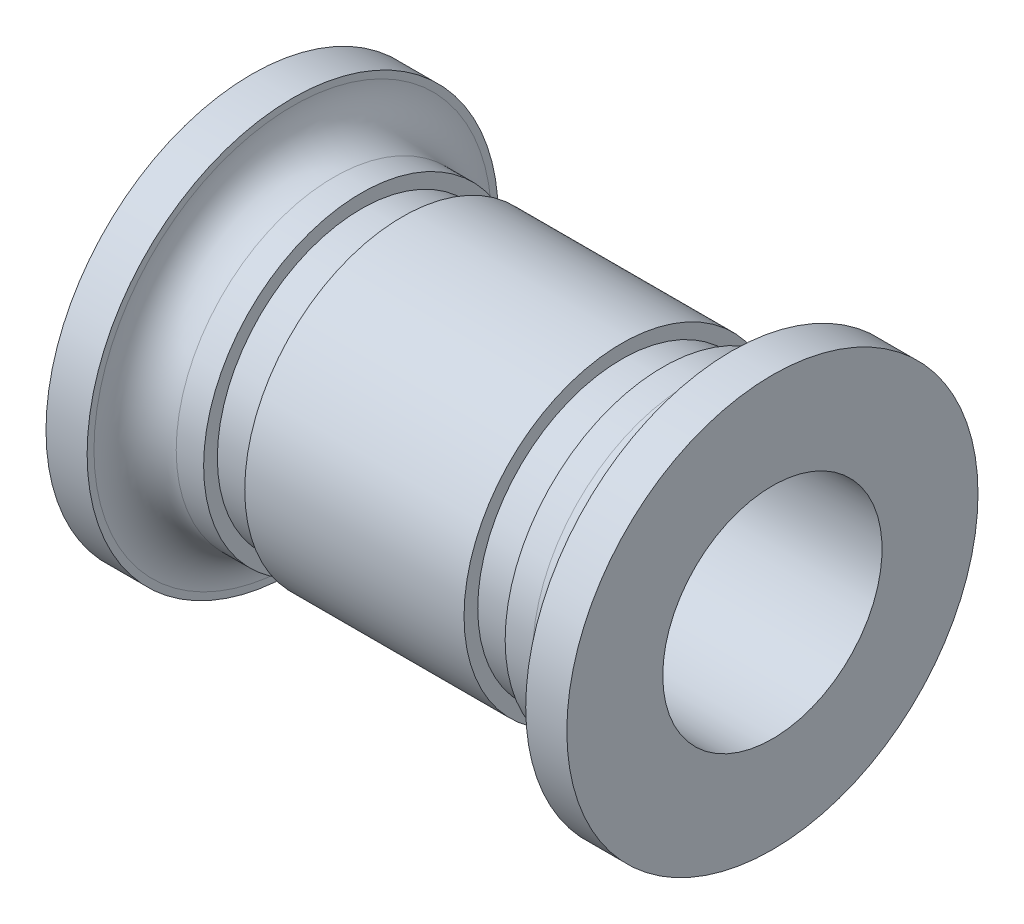
ISO-10303-21;
HEADER;
FILE_DESCRIPTION(('STEP AP214'),'2;1');
FILE_NAME('part.step','',(''),(''),'','','');
FILE_SCHEMA(('AUTOMOTIVE_DESIGN { 1 0 10303 214 1 1 1 1 }'));
ENDSEC;
DATA;
#1=APPLICATION_CONTEXT('core data for automotive mechanical design processes');
#2=APPLICATION_PROTOCOL_DEFINITION('international standard','automotive_design',2000,#1);
#3=PRODUCT_CONTEXT('',#1,'mechanical');
#4=PRODUCT('Part','Part','',(#3));
#5=PRODUCT_RELATED_PRODUCT_CATEGORY('part','',(#4));
#6=PRODUCT_DEFINITION_FORMATION('','',#4);
#7=PRODUCT_DEFINITION_CONTEXT('part definition',#1,'design');
#8=PRODUCT_DEFINITION('design','',#6,#7);
#9=PRODUCT_DEFINITION_SHAPE('','',#8);
#10=(LENGTH_UNIT() NAMED_UNIT(*) SI_UNIT(.MILLI.,.METRE.));
#11=(NAMED_UNIT(*) PLANE_ANGLE_UNIT() SI_UNIT($,.RADIAN.));
#12=(NAMED_UNIT(*) SI_UNIT($,.STERADIAN.) SOLID_ANGLE_UNIT());
#13=UNCERTAINTY_MEASURE_WITH_UNIT(LENGTH_MEASURE(1.E-05),#10,'distance_accuracy_value','');
#14=(GEOMETRIC_REPRESENTATION_CONTEXT(3) GLOBAL_UNCERTAINTY_ASSIGNED_CONTEXT((#13)) GLOBAL_UNIT_ASSIGNED_CONTEXT((#10,
#11,#12)) REPRESENTATION_CONTEXT('',''));
#15=CARTESIAN_POINT('',(0.,0.,0.));
#16=DIRECTION('',(0.,0.,1.));
#17=DIRECTION('',(1.,0.,0.));
#18=AXIS2_PLACEMENT_3D('',#15,#16,#17);
#19=CARTESIAN_POINT('',(320.,0.,0.));
#20=DIRECTION('',(-1.,0.,0.));
#21=DIRECTION('',(0.,0.,1.));
#22=AXIS2_PLACEMENT_3D('',#19,#20,#21);
#23=TOROIDAL_SURFACE('',#22,145.,30.);
#24=CARTESIAN_POINT('',(350.,0.,0.));
#25=DIRECTION('',(-1.,0.,0.));
#26=DIRECTION('',(0.,0.,1.));
#27=AXIS2_PLACEMENT_3D('',#24,#25,#26);
#28=CIRCLE('',#27,145.);
#29=CARTESIAN_POINT('',(350.,0.,145.));
#30=VERTEX_POINT('',#29);
#31=EDGE_CURVE('E100',#30,#30,#28,.T.);
#32=ORIENTED_EDGE('',*,*,#31,.T.);
#33=EDGE_LOOP('',(#32));
#34=FACE_BOUND('',#33,.T.);
#35=CARTESIAN_POINT('',(320.,0.,0.));
#36=DIRECTION('',(-1.,0.,0.));
#37=DIRECTION('',(0.,0.,1.));
#38=AXIS2_PLACEMENT_3D('',#35,#36,#37);
#39=CIRCLE('',#38,115.);
#40=CARTESIAN_POINT('',(320.,0.,115.));
#41=VERTEX_POINT('',#40);
#42=EDGE_CURVE('E10',#41,#41,#39,.T.);
#43=ORIENTED_EDGE('',*,*,#42,.F.);
#44=EDGE_LOOP('',(#43));
#45=FACE_BOUND('',#44,.T.);
#46=ADVANCED_FACE('F39',(#34,#45),#23,.F.);
#47=CARTESIAN_POINT('',(0.,0.,0.));
#48=DIRECTION('',(-1.,0.,0.));
#49=DIRECTION('',(0.,0.,1.));
#50=AXIS2_PLACEMENT_3D('',#47,#48,#49);
#51=CYLINDRICAL_SURFACE('',#50,115.);
#52=ORIENTED_EDGE('',*,*,#42,.T.);
#53=EDGE_LOOP('',(#52));
#54=FACE_BOUND('',#53,.T.);
#55=CARTESIAN_POINT('',(300.,0.,0.));
#56=DIRECTION('',(-1.,0.,0.));
#57=DIRECTION('',(0.,0.,1.));
#58=AXIS2_PLACEMENT_3D('',#55,#56,#57);
#59=CIRCLE('',#58,115.);
#60=CARTESIAN_POINT('',(300.,0.,115.));
#61=VERTEX_POINT('',#60);
#62=EDGE_CURVE('E44',#61,#61,#59,.T.);
#63=ORIENTED_EDGE('',*,*,#62,.F.);
#64=EDGE_LOOP('',(#63));
#65=FACE_BOUND('',#64,.T.);
#66=ADVANCED_FACE('F113',(#54,#65),#51,.T.);
#67=CARTESIAN_POINT('',(300.,1.66533453693774E-12,0.));
#68=DIRECTION('',(1.,0.,0.));
#69=DIRECTION('',(0.,0.,-1.));
#70=AXIS2_PLACEMENT_3D('',#67,#68,#69);
#71=PLANE('',#70);
#72=CARTESIAN_POINT('',(300.,0.,0.));
#73=DIRECTION('',(-1.,0.,0.));
#74=DIRECTION('',(0.,0.,1.));
#75=AXIS2_PLACEMENT_3D('',#72,#73,#74);
#76=CIRCLE('',#75,105.);
#77=CARTESIAN_POINT('',(300.,0.,105.));
#78=VERTEX_POINT('',#77);
#79=EDGE_CURVE('E47',#78,#78,#76,.T.);
#80=ORIENTED_EDGE('',*,*,#79,.F.);
#81=EDGE_LOOP('',(#80));
#82=FACE_BOUND('',#81,.T.);
#83=ORIENTED_EDGE('',*,*,#62,.T.);
#84=EDGE_LOOP('',(#83));
#85=FACE_BOUND('',#84,.T.);
#86=ADVANCED_FACE('F118',(#82,#85),#71,.F.);
#87=CARTESIAN_POINT('',(0.,0.,0.));
#88=DIRECTION('',(-1.,0.,0.));
#89=DIRECTION('',(0.,0.,1.));
#90=AXIS2_PLACEMENT_3D('',#87,#88,#89);
#91=CYLINDRICAL_SURFACE('',#90,105.);
#92=CARTESIAN_POINT('',(270.,0.,0.));
#93=DIRECTION('',(-1.,0.,0.));
#94=DIRECTION('',(0.,0.,1.));
#95=AXIS2_PLACEMENT_3D('',#92,#93,#94);
#96=CIRCLE('',#95,105.);
#97=CARTESIAN_POINT('',(270.,0.,105.));
#98=VERTEX_POINT('',#97);
#99=EDGE_CURVE('E52',#98,#98,#96,.T.);
#100=ORIENTED_EDGE('',*,*,#99,.F.);
#101=EDGE_LOOP('',(#100));
#102=FACE_BOUND('',#101,.T.);
#103=ORIENTED_EDGE('',*,*,#79,.T.);
#104=EDGE_LOOP('',(#103));
#105=FACE_BOUND('',#104,.T.);
#106=ADVANCED_FACE('F125',(#102,#105),#91,.T.);
#107=CARTESIAN_POINT('',(270.,0.,0.));
#108=DIRECTION('',(1.,0.,0.));
#109=DIRECTION('',(0.,0.,-1.));
#110=AXIS2_PLACEMENT_3D('',#107,#108,#109);
#111=PLANE('',#110);
#112=ORIENTED_EDGE('',*,*,#99,.T.);
#113=EDGE_LOOP('',(#112));
#114=FACE_BOUND('',#113,.T.);
#115=CARTESIAN_POINT('',(270.,0.,0.));
#116=DIRECTION('',(-1.,0.,0.));
#117=DIRECTION('',(0.,0.,1.));
#118=AXIS2_PLACEMENT_3D('',#115,#116,#117);
#119=CIRCLE('',#118,115.);
#120=CARTESIAN_POINT('',(270.,0.,115.));
#121=VERTEX_POINT('',#120);
#122=EDGE_CURVE('E59',#121,#121,#119,.T.);
#123=ORIENTED_EDGE('',*,*,#122,.F.);
#124=EDGE_LOOP('',(#123));
#125=FACE_BOUND('',#124,.T.);
#126=ADVANCED_FACE('F128',(#114,#125),#111,.T.);
#127=CARTESIAN_POINT('',(0.,0.,0.));
#128=DIRECTION('',(-1.,0.,0.));
#129=DIRECTION('',(0.,0.,1.));
#130=AXIS2_PLACEMENT_3D('',#127,#128,#129);
#131=CYLINDRICAL_SURFACE('',#130,115.);
#132=CARTESIAN_POINT('',(110.,0.,0.));
#133=DIRECTION('',(-1.,0.,0.));
#134=DIRECTION('',(0.,0.,1.));
#135=AXIS2_PLACEMENT_3D('',#132,#133,#134);
#136=CIRCLE('',#135,115.);
#137=CARTESIAN_POINT('',(110.,0.,115.));
#138=VERTEX_POINT('',#137);
#139=EDGE_CURVE('E64',#138,#138,#136,.T.);
#140=ORIENTED_EDGE('',*,*,#139,.F.);
#141=EDGE_LOOP('',(#140));
#142=FACE_BOUND('',#141,.T.);
#143=ORIENTED_EDGE('',*,*,#122,.T.);
#144=EDGE_LOOP('',(#143));
#145=FACE_BOUND('',#144,.T.);
#146=ADVANCED_FACE('F133',(#142,#145),#131,.T.);
#147=CARTESIAN_POINT('',(110.,3.05311331771919E-13,0.));
#148=DIRECTION('',(1.,0.,0.));
#149=DIRECTION('',(0.,0.,-1.));
#150=AXIS2_PLACEMENT_3D('',#147,#148,#149);
#151=PLANE('',#150);
#152=CARTESIAN_POINT('',(110.,0.,0.));
#153=DIRECTION('',(-1.,0.,0.));
#154=DIRECTION('',(0.,0.,1.));
#155=AXIS2_PLACEMENT_3D('',#152,#153,#154);
#156=CIRCLE('',#155,105.);
#157=CARTESIAN_POINT('',(110.,0.,105.));
#158=VERTEX_POINT('',#157);
#159=EDGE_CURVE('E63',#158,#158,#156,.T.);
#160=ORIENTED_EDGE('',*,*,#159,.F.);
#161=EDGE_LOOP('',(#160));
#162=FACE_BOUND('',#161,.T.);
#163=ORIENTED_EDGE('',*,*,#139,.T.);
#164=EDGE_LOOP('',(#163));
#165=FACE_BOUND('',#164,.T.);
#166=ADVANCED_FACE('F140',(#162,#165),#151,.F.);
#167=CARTESIAN_POINT('',(0.,0.,0.));
#168=DIRECTION('',(-1.,0.,0.));
#169=DIRECTION('',(0.,0.,1.));
#170=AXIS2_PLACEMENT_3D('',#167,#168,#169);
#171=CYLINDRICAL_SURFACE('',#170,105.);
#172=ORIENTED_EDGE('',*,*,#159,.T.);
#173=EDGE_LOOP('',(#172));
#174=FACE_BOUND('',#173,.T.);
#175=CARTESIAN_POINT('',(80.,0.,0.));
#176=DIRECTION('',(-1.,0.,0.));
#177=DIRECTION('',(0.,0.,1.));
#178=AXIS2_PLACEMENT_3D('',#175,#176,#177);
#179=CIRCLE('',#178,105.);
#180=CARTESIAN_POINT('',(80.,0.,105.));
#181=VERTEX_POINT('',#180);
#182=EDGE_CURVE('E69',#181,#181,#179,.T.);
#183=ORIENTED_EDGE('',*,*,#182,.F.);
#184=EDGE_LOOP('',(#183));
#185=FACE_BOUND('',#184,.T.);
#186=ADVANCED_FACE('F142',(#174,#185),#171,.T.);
#187=CARTESIAN_POINT('',(80.,1.11022302462516E-13,0.));
#188=DIRECTION('',(1.,0.,0.));
#189=DIRECTION('',(0.,0.,-1.));
#190=AXIS2_PLACEMENT_3D('',#187,#188,#189);
#191=PLANE('',#190);
#192=ORIENTED_EDGE('',*,*,#182,.T.);
#193=EDGE_LOOP('',(#192));
#194=FACE_BOUND('',#193,.T.);
#195=CARTESIAN_POINT('',(80.,0.,0.));
#196=DIRECTION('',(-1.,0.,0.));
#197=DIRECTION('',(0.,0.,1.));
#198=AXIS2_PLACEMENT_3D('',#195,#196,#197);
#199=CIRCLE('',#198,115.);
#200=CARTESIAN_POINT('',(80.,0.,115.));
#201=VERTEX_POINT('',#200);
#202=EDGE_CURVE('E68',#201,#201,#199,.T.);
#203=ORIENTED_EDGE('',*,*,#202,.F.);
#204=EDGE_LOOP('',(#203));
#205=FACE_BOUND('',#204,.T.);
#206=ADVANCED_FACE('F148',(#194,#205),#191,.T.);
#207=CARTESIAN_POINT('',(0.,0.,0.));
#208=DIRECTION('',(-1.,0.,0.));
#209=DIRECTION('',(0.,0.,1.));
#210=AXIS2_PLACEMENT_3D('',#207,#208,#209);
#211=CYLINDRICAL_SURFACE('',#210,115.);
#212=ORIENTED_EDGE('',*,*,#202,.T.);
#213=EDGE_LOOP('',(#212));
#214=FACE_BOUND('',#213,.T.);
#215=CARTESIAN_POINT('',(60.,0.,0.));
#216=DIRECTION('',(-1.,0.,0.));
#217=DIRECTION('',(0.,0.,1.));
#218=AXIS2_PLACEMENT_3D('',#215,#216,#217);
#219=CIRCLE('',#218,115.);
#220=CARTESIAN_POINT('',(60.,0.,115.));
#221=VERTEX_POINT('',#220);
#222=EDGE_CURVE('E71',#221,#221,#219,.T.);
#223=ORIENTED_EDGE('',*,*,#222,.F.);
#224=EDGE_LOOP('',(#223));
#225=FACE_BOUND('',#224,.T.);
#226=ADVANCED_FACE('F147',(#214,#225),#211,.T.);
#227=CARTESIAN_POINT('',(60.,0.,0.));
#228=DIRECTION('',(-1.,0.,0.));
#229=DIRECTION('',(0.,0.,1.));
#230=AXIS2_PLACEMENT_3D('',#227,#228,#229);
#231=TOROIDAL_SURFACE('',#230,145.,30.);
#232=ORIENTED_EDGE('',*,*,#222,.T.);
#233=EDGE_LOOP('',(#232));
#234=FACE_BOUND('',#233,.T.);
#235=CARTESIAN_POINT('',(30.,0.,0.));
#236=DIRECTION('',(-1.,0.,0.));
#237=DIRECTION('',(0.,0.,1.));
#238=AXIS2_PLACEMENT_3D('',#235,#236,#237);
#239=CIRCLE('',#238,145.);
#240=CARTESIAN_POINT('',(30.,0.,145.));
#241=VERTEX_POINT('',#240);
#242=EDGE_CURVE('E79',#241,#241,#239,.T.);
#243=ORIENTED_EDGE('',*,*,#242,.F.);
#244=EDGE_LOOP('',(#243));
#245=FACE_BOUND('',#244,.T.);
#246=ADVANCED_FACE('F152',(#234,#245),#231,.F.);
#247=CARTESIAN_POINT('',(30.,0.,0.));
#248=DIRECTION('',(1.,0.,0.));
#249=DIRECTION('',(0.,0.,-1.));
#250=AXIS2_PLACEMENT_3D('',#247,#248,#249);
#251=PLANE('',#250);
#252=ORIENTED_EDGE('',*,*,#242,.T.);
#253=EDGE_LOOP('',(#252));
#254=FACE_BOUND('',#253,.T.);
#255=CARTESIAN_POINT('',(30.,0.,0.));
#256=DIRECTION('',(-1.,0.,0.));
#257=DIRECTION('',(0.,0.,1.));
#258=AXIS2_PLACEMENT_3D('',#255,#256,#257);
#259=CIRCLE('',#258,150.);
#260=CARTESIAN_POINT('',(30.,0.,150.));
#261=VERTEX_POINT('',#260);
#262=EDGE_CURVE('E78',#261,#261,#259,.T.);
#263=ORIENTED_EDGE('',*,*,#262,.F.);
#264=EDGE_LOOP('',(#263));
#265=FACE_BOUND('',#264,.T.);
#266=ADVANCED_FACE('F158',(#254,#265),#251,.T.);
#267=CARTESIAN_POINT('',(0.,0.,0.));
#268=DIRECTION('',(-1.,0.,0.));
#269=DIRECTION('',(0.,0.,1.));
#270=AXIS2_PLACEMENT_3D('',#267,#268,#269);
#271=CYLINDRICAL_SURFACE('',#270,150.);
#272=ORIENTED_EDGE('',*,*,#262,.T.);
#273=EDGE_LOOP('',(#272));
#274=FACE_BOUND('',#273,.T.);
#275=CARTESIAN_POINT('',(0.,0.,0.));
#276=DIRECTION('',(-1.,0.,0.));
#277=DIRECTION('',(0.,0.,1.));
#278=AXIS2_PLACEMENT_3D('',#275,#276,#277);
#279=CIRCLE('',#278,150.);
#280=CARTESIAN_POINT('',(0.,0.,150.));
#281=VERTEX_POINT('',#280);
#282=EDGE_CURVE('E84',#281,#281,#279,.T.);
#283=ORIENTED_EDGE('',*,*,#282,.F.);
#284=EDGE_LOOP('',(#283));
#285=FACE_BOUND('',#284,.T.);
#286=ADVANCED_FACE('F165',(#274,#285),#271,.T.);
#287=CARTESIAN_POINT('',(0.,0.,0.));
#288=DIRECTION('',(1.,0.,0.));
#289=DIRECTION('',(0.,0.,-1.));
#290=AXIS2_PLACEMENT_3D('',#287,#288,#289);
#291=PLANE('',#290);
#292=CARTESIAN_POINT('',(0.,0.,0.));
#293=DIRECTION('',(-1.,0.,0.));
#294=DIRECTION('',(0.,0.,1.));
#295=AXIS2_PLACEMENT_3D('',#292,#293,#294);
#296=CIRCLE('',#295,80.);
#297=CARTESIAN_POINT('',(0.,0.,80.));
#298=VERTEX_POINT('',#297);
#299=EDGE_CURVE('E83',#298,#298,#296,.T.);
#300=ORIENTED_EDGE('',*,*,#299,.F.);
#301=EDGE_LOOP('',(#300));
#302=FACE_BOUND('',#301,.T.);
#303=ORIENTED_EDGE('',*,*,#282,.T.);
#304=EDGE_LOOP('',(#303));
#305=FACE_BOUND('',#304,.T.);
#306=ADVANCED_FACE('F167',(#302,#305),#291,.F.);
#307=CARTESIAN_POINT('',(0.,0.,0.));
#308=DIRECTION('',(-1.,0.,0.));
#309=DIRECTION('',(0.,0.,1.));
#310=AXIS2_PLACEMENT_3D('',#307,#308,#309);
#311=CYLINDRICAL_SURFACE('',#310,80.);
#312=CARTESIAN_POINT('',(380.,0.,0.));
#313=DIRECTION('',(-1.,0.,0.));
#314=DIRECTION('',(0.,0.,1.));
#315=AXIS2_PLACEMENT_3D('',#312,#313,#314);
#316=CIRCLE('',#315,80.);
#317=CARTESIAN_POINT('',(380.,0.,80.));
#318=VERTEX_POINT('',#317);
#319=EDGE_CURVE('E86',#318,#318,#316,.T.);
#320=ORIENTED_EDGE('',*,*,#319,.F.);
#321=EDGE_LOOP('',(#320));
#322=FACE_BOUND('',#321,.T.);
#323=ORIENTED_EDGE('',*,*,#299,.T.);
#324=EDGE_LOOP('',(#323));
#325=FACE_BOUND('',#324,.T.);
#326=ADVANCED_FACE('F168',(#322,#325),#311,.F.);
#327=CARTESIAN_POINT('',(380.,-3.01346249541114E-13,0.));
#328=DIRECTION('',(1.,0.,0.));
#329=DIRECTION('',(0.,0.,-1.));
#330=AXIS2_PLACEMENT_3D('',#327,#328,#329);
#331=PLANE('',#330);
#332=ORIENTED_EDGE('',*,*,#319,.T.);
#333=EDGE_LOOP('',(#332));
#334=FACE_BOUND('',#333,.T.);
#335=CARTESIAN_POINT('',(380.,0.,0.));
#336=DIRECTION('',(-1.,0.,0.));
#337=DIRECTION('',(0.,0.,1.));
#338=AXIS2_PLACEMENT_3D('',#335,#336,#337);
#339=CIRCLE('',#338,150.);
#340=CARTESIAN_POINT('',(380.,0.,150.));
#341=VERTEX_POINT('',#340);
#342=EDGE_CURVE('E93',#341,#341,#339,.T.);
#343=ORIENTED_EDGE('',*,*,#342,.F.);
#344=EDGE_LOOP('',(#343));
#345=FACE_BOUND('',#344,.T.);
#346=ADVANCED_FACE('F112',(#334,#345),#331,.T.);
#347=CARTESIAN_POINT('',(0.,0.,0.));
#348=DIRECTION('',(-1.,0.,0.));
#349=DIRECTION('',(0.,0.,1.));
#350=AXIS2_PLACEMENT_3D('',#347,#348,#349);
#351=CYLINDRICAL_SURFACE('',#350,150.);
#352=CARTESIAN_POINT('',(350.,0.,0.));
#353=DIRECTION('',(-1.,0.,0.));
#354=DIRECTION('',(0.,0.,1.));
#355=AXIS2_PLACEMENT_3D('',#352,#353,#354);
#356=CIRCLE('',#355,150.);
#357=CARTESIAN_POINT('',(350.,0.,150.));
#358=VERTEX_POINT('',#357);
#359=EDGE_CURVE('E94',#358,#358,#356,.T.);
#360=ORIENTED_EDGE('',*,*,#359,.F.);
#361=EDGE_LOOP('',(#360));
#362=FACE_BOUND('',#361,.T.);
#363=ORIENTED_EDGE('',*,*,#342,.T.);
#364=EDGE_LOOP('',(#363));
#365=FACE_BOUND('',#364,.T.);
#366=ADVANCED_FACE('F104',(#362,#365),#351,.T.);
#367=CARTESIAN_POINT('',(350.,0.,0.));
#368=DIRECTION('',(-1.,0.,0.));
#369=DIRECTION('',(0.,0.,1.));
#370=AXIS2_PLACEMENT_3D('',#367,#368,#369);
#371=PLANE('',#370);
#372=ORIENTED_EDGE('',*,*,#359,.T.);
#373=EDGE_LOOP('',(#372));
#374=FACE_BOUND('',#373,.T.);
#375=ORIENTED_EDGE('',*,*,#31,.F.);
#376=EDGE_LOOP('',(#375));
#377=FACE_BOUND('',#376,.T.);
#378=ADVANCED_FACE('F103',(#374,#377),#371,.T.);
#379=CLOSED_SHELL('',(#46,#66,#86,#106,#126,#146,#166,#186,#206,#226,#246,#266,#286,#306,#326,
#346,#366,#378));
#380=MANIFOLD_SOLID_BREP('B2',#379);
#381=ADVANCED_BREP_SHAPE_REPRESENTATION('',(#18,#380),#14);
#382=SHAPE_DEFINITION_REPRESENTATION(#9,#381);
ENDSEC;
END-ISO-10303-21;
